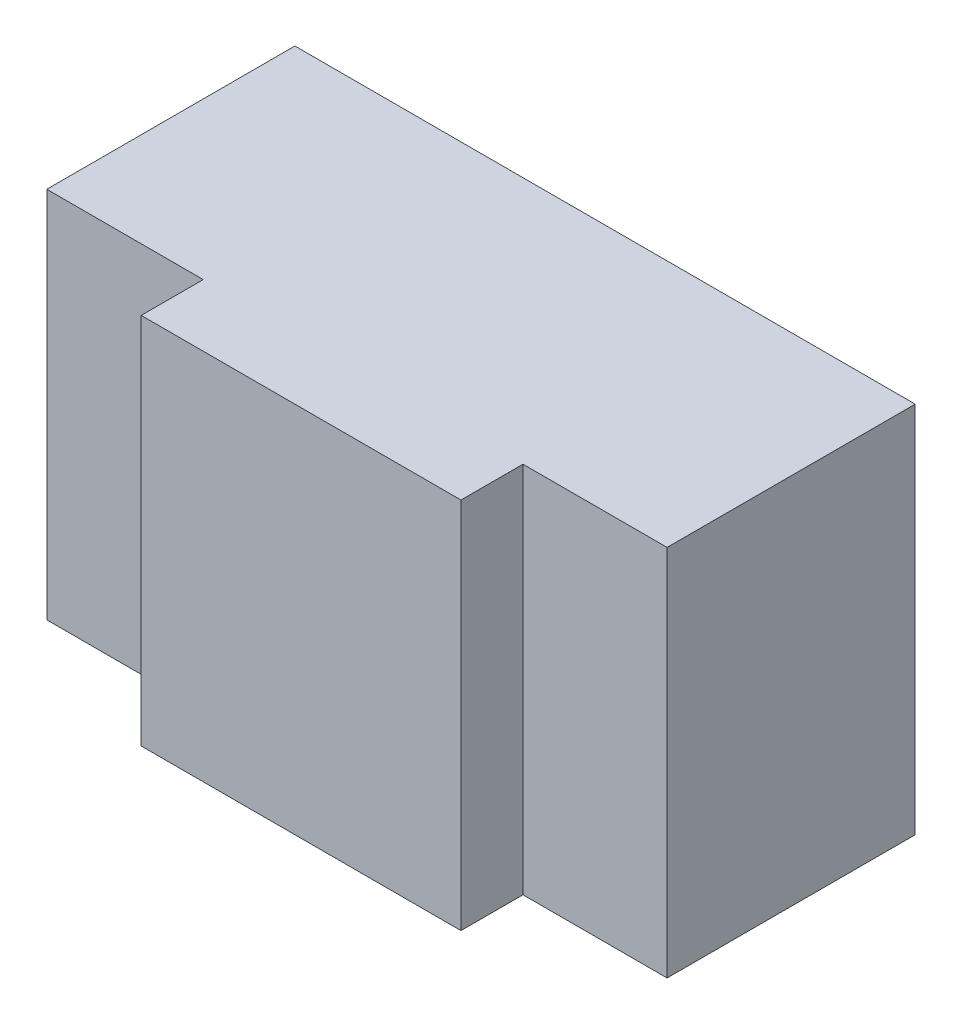
ISO-10303-21;
HEADER;
FILE_DESCRIPTION(('STEP AP214'),'2;1');
FILE_NAME('part.step','',(''),(''),'','','');
FILE_SCHEMA(('AUTOMOTIVE_DESIGN { 1 0 10303 214 1 1 1 1 }'));
ENDSEC;
DATA;
#1=APPLICATION_CONTEXT('core data for automotive mechanical design processes');
#2=APPLICATION_PROTOCOL_DEFINITION('international standard','automotive_design',2000,#1);
#3=PRODUCT_CONTEXT('',#1,'mechanical');
#4=PRODUCT('Part','Part','',(#3));
#5=PRODUCT_RELATED_PRODUCT_CATEGORY('part','',(#4));
#6=PRODUCT_DEFINITION_FORMATION('','',#4);
#7=PRODUCT_DEFINITION_CONTEXT('part definition',#1,'design');
#8=PRODUCT_DEFINITION('design','',#6,#7);
#9=PRODUCT_DEFINITION_SHAPE('','',#8);
#10=(LENGTH_UNIT() NAMED_UNIT(*) SI_UNIT(.MILLI.,.METRE.));
#11=(NAMED_UNIT(*) PLANE_ANGLE_UNIT() SI_UNIT($,.RADIAN.));
#12=(NAMED_UNIT(*) SI_UNIT($,.STERADIAN.) SOLID_ANGLE_UNIT());
#13=UNCERTAINTY_MEASURE_WITH_UNIT(LENGTH_MEASURE(1.E-05),#10,'distance_accuracy_value','');
#14=(GEOMETRIC_REPRESENTATION_CONTEXT(3) GLOBAL_UNCERTAINTY_ASSIGNED_CONTEXT((#13)) GLOBAL_UNIT_ASSIGNED_CONTEXT((#10,
#11,#12)) REPRESENTATION_CONTEXT('',''));
#15=CARTESIAN_POINT('',(0.,0.,0.));
#16=DIRECTION('',(0.,0.,1.));
#17=DIRECTION('',(1.,0.,0.));
#18=AXIS2_PLACEMENT_3D('',#15,#16,#17);
#19=CARTESIAN_POINT('',(0.,0.,0.5));
#20=DIRECTION('',(-1.,0.,0.));
#21=DIRECTION('',(0.,0.,1.));
#22=AXIS2_PLACEMENT_3D('',#19,#20,#21);
#23=PLANE('',#22);
#24=DIRECTION('',(0.,1.,0.));
#25=VECTOR('',#24,1.);
#26=CARTESIAN_POINT('',(0.,0.,0.4));
#27=LINE('',#26,#25);
#28=CARTESIAN_POINT('',(0.,0.,0.4));
#29=VERTEX_POINT('',#28);
#30=CARTESIAN_POINT('',(0.,0.601167315175097,0.4));
#31=VERTEX_POINT('',#30);
#32=EDGE_CURVE('E125',#29,#31,#27,.T.);
#33=ORIENTED_EDGE('',*,*,#32,.F.);
#34=DIRECTION('',(0.,0.,-1.));
#35=VECTOR('',#34,1.);
#36=CARTESIAN_POINT('',(0.,0.,0.5));
#37=LINE('',#36,#35);
#38=CARTESIAN_POINT('',(0.,0.,0.));
#39=VERTEX_POINT('',#38);
#40=EDGE_CURVE('E136',#29,#39,#37,.T.);
#41=ORIENTED_EDGE('',*,*,#40,.T.);
#42=DIRECTION('',(0.,1.,0.));
#43=VECTOR('',#42,1.);
#44=CARTESIAN_POINT('',(0.,0.,0.));
#45=LINE('',#44,#43);
#46=CARTESIAN_POINT('',(0.,0.601167315175097,0.));
#47=VERTEX_POINT('',#46);
#48=EDGE_CURVE('E137',#39,#47,#45,.T.);
#49=ORIENTED_EDGE('',*,*,#48,.T.);
#50=DIRECTION('',(0.,0.,-1.));
#51=VECTOR('',#50,1.);
#52=CARTESIAN_POINT('',(0.,0.601167315175097,0.5));
#53=LINE('',#52,#51);
#54=EDGE_CURVE('E152',#31,#47,#53,.T.);
#55=ORIENTED_EDGE('',*,*,#54,.F.);
#56=EDGE_LOOP('',(#33,#41,#49,#55));
#57=FACE_BOUND('',#56,.T.);
#58=ADVANCED_FACE('F36',(#57),#23,.F.);
#59=CARTESIAN_POINT('',(0.,0.601167315175097,0.5));
#60=DIRECTION('',(0.,-1.,0.));
#61=DIRECTION('',(0.,0.,-1.));
#62=AXIS2_PLACEMENT_3D('',#59,#60,#61);
#63=PLANE('',#62);
#64=DIRECTION('',(0.,0.,1.));
#65=VECTOR('',#64,1.);
#66=CARTESIAN_POINT('',(-0.747795948417811,0.601167315175097,0.4));
#67=LINE('',#66,#65);
#68=CARTESIAN_POINT('',(-0.747795948417811,0.601167315175097,0.4));
#69=VERTEX_POINT('',#68);
#70=CARTESIAN_POINT('',(-0.747795948417811,0.601167315175097,0.5));
#71=VERTEX_POINT('',#70);
#72=EDGE_CURVE('E110',#69,#71,#67,.T.);
#73=ORIENTED_EDGE('',*,*,#72,.T.);
#74=DIRECTION('',(-1.,0.,0.));
#75=VECTOR('',#74,1.);
#76=CARTESIAN_POINT('',(0.,0.601167315175097,0.5));
#77=LINE('',#76,#75);
#78=CARTESIAN_POINT('',(-0.232291877155757,0.601167315175097,0.5));
#79=VERTEX_POINT('',#78);
#80=EDGE_CURVE('E131',#79,#71,#77,.T.);
#81=ORIENTED_EDGE('',*,*,#80,.F.);
#82=DIRECTION('',(0.,0.,1.));
#83=VECTOR('',#82,1.);
#84=CARTESIAN_POINT('',(-0.232291877155757,0.601167315175097,0.4));
#85=LINE('',#84,#83);
#86=CARTESIAN_POINT('',(-0.232291877155757,0.601167315175097,0.4));
#87=VERTEX_POINT('',#86);
#88=EDGE_CURVE('E58',#87,#79,#85,.T.);
#89=ORIENTED_EDGE('',*,*,#88,.F.);
#90=DIRECTION('',(-1.,0.,0.));
#91=VECTOR('',#90,1.);
#92=CARTESIAN_POINT('',(0.,0.601167315175097,0.4));
#93=LINE('',#92,#91);
#94=EDGE_CURVE('E127',#31,#87,#93,.T.);
#95=ORIENTED_EDGE('',*,*,#94,.F.);
#96=ORIENTED_EDGE('',*,*,#54,.T.);
#97=DIRECTION('',(-1.,0.,0.));
#98=VECTOR('',#97,1.);
#99=CARTESIAN_POINT('',(0.,0.601167315175097,0.));
#100=LINE('',#99,#98);
#101=CARTESIAN_POINT('',(-1.,0.601167315175097,0.));
#102=VERTEX_POINT('',#101);
#103=EDGE_CURVE('E140',#47,#102,#100,.T.);
#104=ORIENTED_EDGE('',*,*,#103,.T.);
#105=DIRECTION('',(0.,0.,-1.));
#106=VECTOR('',#105,1.);
#107=CARTESIAN_POINT('',(-1.,0.601167315175097,0.5));
#108=LINE('',#107,#106);
#109=CARTESIAN_POINT('',(-1.,0.601167315175097,0.4));
#110=VERTEX_POINT('',#109);
#111=EDGE_CURVE('E151',#110,#102,#108,.T.);
#112=ORIENTED_EDGE('',*,*,#111,.F.);
#113=EDGE_CURVE('E129',#69,#110,#93,.T.);
#114=ORIENTED_EDGE('',*,*,#113,.F.);
#115=EDGE_LOOP('',(#73,#81,#89,#95,#96,#104,#112,#114));
#116=FACE_BOUND('',#115,.T.);
#117=ADVANCED_FACE('F170',(#116),#63,.F.);
#118=CARTESIAN_POINT('',(-1.,0.,0.5));
#119=DIRECTION('',(1.,0.,0.));
#120=DIRECTION('',(0.,0.,-1.));
#121=AXIS2_PLACEMENT_3D('',#118,#119,#120);
#122=PLANE('',#121);
#123=DIRECTION('',(0.,-1.,0.));
#124=VECTOR('',#123,1.);
#125=CARTESIAN_POINT('',(-1.,0.,0.4));
#126=LINE('',#125,#124);
#127=CARTESIAN_POINT('',(-1.,0.,0.4));
#128=VERTEX_POINT('',#127);
#129=EDGE_CURVE('E105',#110,#128,#126,.T.);
#130=ORIENTED_EDGE('',*,*,#129,.F.);
#131=ORIENTED_EDGE('',*,*,#111,.T.);
#132=DIRECTION('',(0.,-1.,0.));
#133=VECTOR('',#132,1.);
#134=CARTESIAN_POINT('',(-1.,0.,0.));
#135=LINE('',#134,#133);
#136=CARTESIAN_POINT('',(-1.,0.,0.));
#137=VERTEX_POINT('',#136);
#138=EDGE_CURVE('E143',#102,#137,#135,.T.);
#139=ORIENTED_EDGE('',*,*,#138,.T.);
#140=DIRECTION('',(0.,0.,-1.));
#141=VECTOR('',#140,1.);
#142=CARTESIAN_POINT('',(-1.,0.,0.5));
#143=LINE('',#142,#141);
#144=EDGE_CURVE('E149',#128,#137,#143,.T.);
#145=ORIENTED_EDGE('',*,*,#144,.F.);
#146=EDGE_LOOP('',(#130,#131,#139,#145));
#147=FACE_BOUND('',#146,.T.);
#148=ADVANCED_FACE('F172',(#147),#122,.F.);
#149=CARTESIAN_POINT('',(0.,0.,0.5));
#150=DIRECTION('',(0.,1.,0.));
#151=DIRECTION('',(0.,0.,1.));
#152=AXIS2_PLACEMENT_3D('',#149,#150,#151);
#153=PLANE('',#152);
#154=DIRECTION('',(0.,0.,1.));
#155=VECTOR('',#154,1.);
#156=CARTESIAN_POINT('',(-0.747795948417811,0.,0.4));
#157=LINE('',#156,#155);
#158=CARTESIAN_POINT('',(-0.747795948417811,0.,0.4));
#159=VERTEX_POINT('',#158);
#160=CARTESIAN_POINT('',(-0.747795948417811,0.,0.5));
#161=VERTEX_POINT('',#160);
#162=EDGE_CURVE('E50',#159,#161,#157,.T.);
#163=ORIENTED_EDGE('',*,*,#162,.F.);
#164=DIRECTION('',(1.,0.,0.));
#165=VECTOR('',#164,1.);
#166=CARTESIAN_POINT('',(0.,0.,0.4));
#167=LINE('',#166,#165);
#168=EDGE_CURVE('E12',#128,#159,#167,.T.);
#169=ORIENTED_EDGE('',*,*,#168,.F.);
#170=ORIENTED_EDGE('',*,*,#144,.T.);
#171=DIRECTION('',(1.,0.,0.));
#172=VECTOR('',#171,1.);
#173=CARTESIAN_POINT('',(0.,0.,0.));
#174=LINE('',#173,#172);
#175=EDGE_CURVE('E134',#137,#39,#174,.T.);
#176=ORIENTED_EDGE('',*,*,#175,.T.);
#177=ORIENTED_EDGE('',*,*,#40,.F.);
#178=CARTESIAN_POINT('',(-0.232291877155757,0.,0.4));
#179=VERTEX_POINT('',#178);
#180=EDGE_CURVE('E39',#179,#29,#167,.T.);
#181=ORIENTED_EDGE('',*,*,#180,.F.);
#182=DIRECTION('',(0.,0.,1.));
#183=VECTOR('',#182,1.);
#184=CARTESIAN_POINT('',(-0.232291877155757,0.,0.4));
#185=LINE('',#184,#183);
#186=CARTESIAN_POINT('',(-0.232291877155757,0.,0.5));
#187=VERTEX_POINT('',#186);
#188=EDGE_CURVE('E119',#179,#187,#185,.T.);
#189=ORIENTED_EDGE('',*,*,#188,.T.);
#190=DIRECTION('',(1.,0.,0.));
#191=VECTOR('',#190,1.);
#192=CARTESIAN_POINT('',(0.,0.,0.5));
#193=LINE('',#192,#191);
#194=EDGE_CURVE('E118',#161,#187,#193,.T.);
#195=ORIENTED_EDGE('',*,*,#194,.F.);
#196=EDGE_LOOP('',(#163,#169,#170,#176,#177,#181,#189,#195));
#197=FACE_BOUND('',#196,.T.);
#198=ADVANCED_FACE('F115',(#197),#153,.F.);
#199=CARTESIAN_POINT('',(0.,0.,0.5));
#200=DIRECTION('',(0.,0.,1.));
#201=DIRECTION('',(1.,0.,0.));
#202=AXIS2_PLACEMENT_3D('',#199,#200,#201);
#203=PLANE('',#202);
#204=ORIENTED_EDGE('',*,*,#80,.T.);
#205=DIRECTION('',(0.,-1.,0.));
#206=VECTOR('',#205,1.);
#207=CARTESIAN_POINT('',(-0.747795948417811,0.601167315175097,0.5));
#208=LINE('',#207,#206);
#209=EDGE_CURVE('E254',#71,#161,#208,.T.);
#210=ORIENTED_EDGE('',*,*,#209,.T.);
#211=ORIENTED_EDGE('',*,*,#194,.T.);
#212=DIRECTION('',(0.,1.,0.));
#213=VECTOR('',#212,1.);
#214=CARTESIAN_POINT('',(-0.232291877155757,0.601167315175097,0.5));
#215=LINE('',#214,#213);
#216=EDGE_CURVE('E112',#187,#79,#215,.T.);
#217=ORIENTED_EDGE('',*,*,#216,.T.);
#218=EDGE_LOOP('',(#204,#210,#211,#217));
#219=FACE_BOUND('',#218,.T.);
#220=ADVANCED_FACE('F179',(#219),#203,.T.);
#221=CARTESIAN_POINT('',(0.,0.,0.));
#222=DIRECTION('',(0.,0.,1.));
#223=DIRECTION('',(1.,0.,0.));
#224=AXIS2_PLACEMENT_3D('',#221,#222,#223);
#225=PLANE('',#224);
#226=ORIENTED_EDGE('',*,*,#48,.F.);
#227=ORIENTED_EDGE('',*,*,#175,.F.);
#228=ORIENTED_EDGE('',*,*,#138,.F.);
#229=ORIENTED_EDGE('',*,*,#103,.F.);
#230=EDGE_LOOP('',(#226,#227,#228,#229));
#231=FACE_BOUND('',#230,.T.);
#232=ADVANCED_FACE('F168',(#231),#225,.F.);
#233=CARTESIAN_POINT('',(-0.232291877155757,0.601167315175097,0.4));
#234=DIRECTION('',(1.,0.,0.));
#235=DIRECTION('',(0.,0.,-1.));
#236=AXIS2_PLACEMENT_3D('',#233,#234,#235);
#237=PLANE('',#236);
#238=ORIENTED_EDGE('',*,*,#216,.F.);
#239=ORIENTED_EDGE('',*,*,#188,.F.);
#240=DIRECTION('',(0.,1.,0.));
#241=VECTOR('',#240,1.);
#242=CARTESIAN_POINT('',(-0.232291877155757,0.601167315175097,0.4));
#243=LINE('',#242,#241);
#244=EDGE_CURVE('E111',#179,#87,#243,.T.);
#245=ORIENTED_EDGE('',*,*,#244,.T.);
#246=ORIENTED_EDGE('',*,*,#88,.T.);
#247=EDGE_LOOP('',(#238,#239,#245,#246));
#248=FACE_BOUND('',#247,.T.);
#249=ADVANCED_FACE('F215',(#248),#237,.T.);
#250=CARTESIAN_POINT('',(-0.5,0.300583657587549,0.4));
#251=DIRECTION('',(0.,0.,1.));
#252=DIRECTION('',(1.,0.,0.));
#253=AXIS2_PLACEMENT_3D('',#250,#251,#252);
#254=PLANE('',#253);
#255=ORIENTED_EDGE('',*,*,#94,.T.);
#256=ORIENTED_EDGE('',*,*,#244,.F.);
#257=ORIENTED_EDGE('',*,*,#180,.T.);
#258=ORIENTED_EDGE('',*,*,#32,.T.);
#259=EDGE_LOOP('',(#255,#256,#257,#258));
#260=FACE_BOUND('',#259,.T.);
#261=ADVANCED_FACE('F160',(#260),#254,.T.);
#262=ORIENTED_EDGE('',*,*,#113,.T.);
#263=ORIENTED_EDGE('',*,*,#129,.T.);
#264=ORIENTED_EDGE('',*,*,#168,.T.);
#265=DIRECTION('',(0.,-1.,0.));
#266=VECTOR('',#265,1.);
#267=CARTESIAN_POINT('',(-0.747795948417811,0.601167315175097,0.4));
#268=LINE('',#267,#266);
#269=EDGE_CURVE('E102',#69,#159,#268,.T.);
#270=ORIENTED_EDGE('',*,*,#269,.F.);
#271=EDGE_LOOP('',(#262,#263,#264,#270));
#272=FACE_BOUND('',#271,.T.);
#273=ADVANCED_FACE('F101',(#272),#254,.T.);
#274=CARTESIAN_POINT('',(-0.747795948417811,0.601167315175097,0.4));
#275=DIRECTION('',(-1.,0.,0.));
#276=DIRECTION('',(0.,0.,1.));
#277=AXIS2_PLACEMENT_3D('',#274,#275,#276);
#278=PLANE('',#277);
#279=ORIENTED_EDGE('',*,*,#209,.F.);
#280=ORIENTED_EDGE('',*,*,#72,.F.);
#281=ORIENTED_EDGE('',*,*,#269,.T.);
#282=ORIENTED_EDGE('',*,*,#162,.T.);
#283=EDGE_LOOP('',(#279,#280,#281,#282));
#284=FACE_BOUND('',#283,.T.);
#285=ADVANCED_FACE('F108',(#284),#278,.T.);
#286=CLOSED_SHELL('',(#58,#117,#148,#198,#220,#232,#249,#261,#273,#285));
#287=MANIFOLD_SOLID_BREP('B2',#286);
#288=ADVANCED_BREP_SHAPE_REPRESENTATION('',(#18,#287),#14);
#289=SHAPE_DEFINITION_REPRESENTATION(#9,#288);
ENDSEC;
END-ISO-10303-21;
